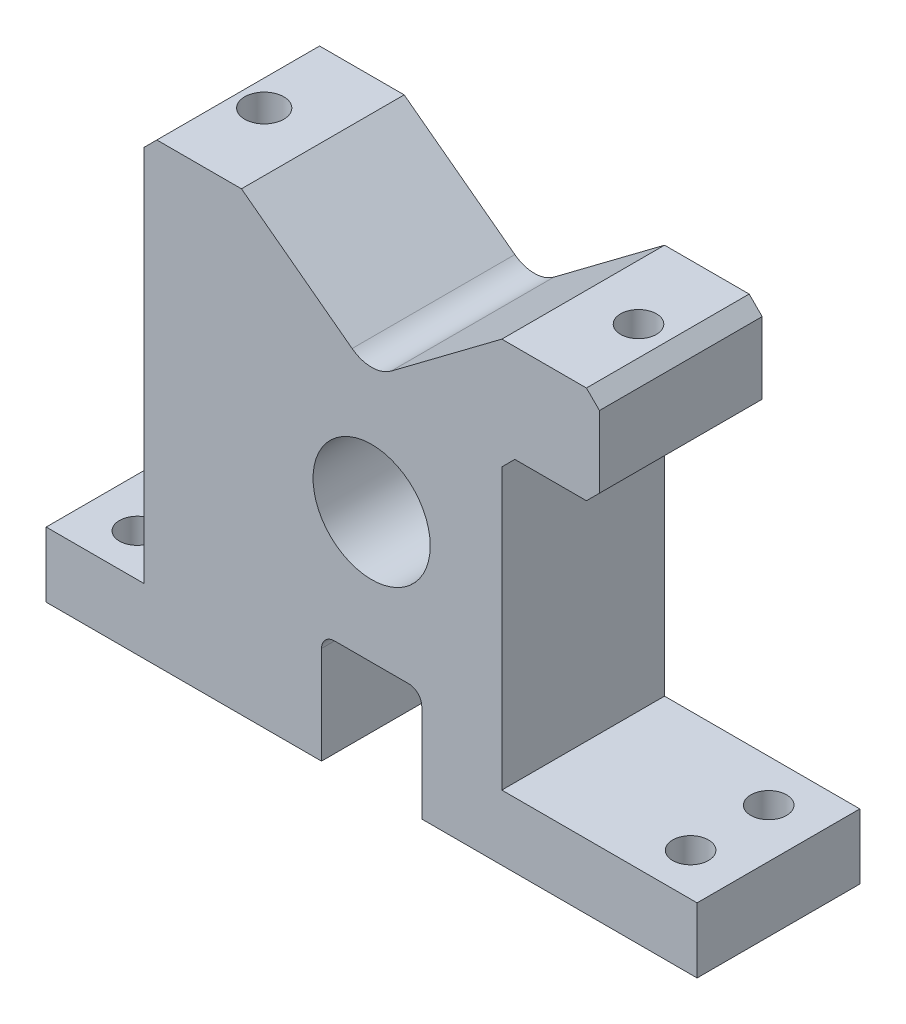
ISO-10303-21;
HEADER;
FILE_DESCRIPTION(('STEP AP214'),'2;1');
FILE_NAME('part.step','',(''),(''),'','','');
FILE_SCHEMA(('AUTOMOTIVE_DESIGN { 1 0 10303 214 1 1 1 1 }'));
ENDSEC;
DATA;
#1=APPLICATION_CONTEXT('core data for automotive mechanical design processes');
#2=APPLICATION_PROTOCOL_DEFINITION('international standard','automotive_design',2000,#1);
#3=PRODUCT_CONTEXT('',#1,'mechanical');
#4=PRODUCT('Part','Part','',(#3));
#5=PRODUCT_RELATED_PRODUCT_CATEGORY('part','',(#4));
#6=PRODUCT_DEFINITION_FORMATION('','',#4);
#7=PRODUCT_DEFINITION_CONTEXT('part definition',#1,'design');
#8=PRODUCT_DEFINITION('design','',#6,#7);
#9=PRODUCT_DEFINITION_SHAPE('','',#8);
#10=(LENGTH_UNIT() NAMED_UNIT(*) SI_UNIT(.MILLI.,.METRE.));
#11=(NAMED_UNIT(*) PLANE_ANGLE_UNIT() SI_UNIT($,.RADIAN.));
#12=(NAMED_UNIT(*) SI_UNIT($,.STERADIAN.) SOLID_ANGLE_UNIT());
#13=UNCERTAINTY_MEASURE_WITH_UNIT(LENGTH_MEASURE(1.E-05),#10,'distance_accuracy_value','');
#14=(GEOMETRIC_REPRESENTATION_CONTEXT(3) GLOBAL_UNCERTAINTY_ASSIGNED_CONTEXT((#13)) GLOBAL_UNIT_ASSIGNED_CONTEXT((#10,
#11,#12)) REPRESENTATION_CONTEXT('',''));
#15=CARTESIAN_POINT('',(0.,0.,0.));
#16=DIRECTION('',(0.,0.,1.));
#17=DIRECTION('',(1.,0.,0.));
#18=AXIS2_PLACEMENT_3D('',#15,#16,#17);
#19=CARTESIAN_POINT('',(0.,37.,25.));
#20=DIRECTION('',(0.,0.,-1.));
#21=DIRECTION('',(-1.,0.,0.));
#22=AXIS2_PLACEMENT_3D('',#19,#20,#21);
#23=CYLINDRICAL_SURFACE('',#22,11.2);
#24=CARTESIAN_POINT('',(0.,37.,0.));
#25=DIRECTION('',(0.,0.,-1.));
#26=DIRECTION('',(-1.,0.,0.));
#27=AXIS2_PLACEMENT_3D('',#24,#25,#26);
#28=CIRCLE('',#27,11.2);
#29=CARTESIAN_POINT('',(-11.2,37.,0.));
#30=VERTEX_POINT('',#29);
#31=EDGE_CURVE('E251',#30,#30,#28,.T.);
#32=ORIENTED_EDGE('',*,*,#31,.T.);
#33=EDGE_LOOP('',(#32));
#34=FACE_BOUND('',#33,.T.);
#35=CARTESIAN_POINT('',(0.,37.,7.));
#36=DIRECTION('',(0.,0.,1.));
#37=DIRECTION('',(1.,0.,0.));
#38=AXIS2_PLACEMENT_3D('',#35,#36,#37);
#39=CIRCLE('',#38,11.2);
#40=CARTESIAN_POINT('',(11.2,37.,7.));
#41=VERTEX_POINT('',#40);
#42=EDGE_CURVE('E11',#41,#41,#39,.F.);
#43=ORIENTED_EDGE('',*,*,#42,.F.);
#44=EDGE_LOOP('',(#43));
#45=FACE_BOUND('',#44,.T.);
#46=ADVANCED_FACE('F38',(#34,#45),#23,.F.);
#47=CARTESIAN_POINT('',(7.7,0.,25.));
#48=DIRECTION('',(0.,1.,0.));
#49=DIRECTION('',(-1.,0.,0.));
#50=AXIS2_PLACEMENT_3D('',#47,#48,#49);
#51=PLANE('',#50);
#52=CARTESIAN_POINT('',(42.5,0.,18.5));
#53=DIRECTION('',(0.,1.,0.));
#54=DIRECTION('',(-1.,0.,0.));
#55=AXIS2_PLACEMENT_3D('',#52,#53,#54);
#56=CIRCLE('',#55,2.74999999999999);
#57=CARTESIAN_POINT('',(39.75,0.,18.5));
#58=VERTEX_POINT('',#57);
#59=EDGE_CURVE('E226',#58,#58,#56,.T.);
#60=ORIENTED_EDGE('',*,*,#59,.T.);
#61=EDGE_LOOP('',(#60));
#62=FACE_BOUND('',#61,.T.);
#63=CARTESIAN_POINT('',(42.5,0.,6.5));
#64=DIRECTION('',(0.,1.,0.));
#65=DIRECTION('',(-1.,0.,0.));
#66=AXIS2_PLACEMENT_3D('',#63,#64,#65);
#67=CIRCLE('',#66,2.74999999999999);
#68=CARTESIAN_POINT('',(39.75,0.,6.5));
#69=VERTEX_POINT('',#68);
#70=EDGE_CURVE('E232',#69,#69,#67,.T.);
#71=ORIENTED_EDGE('',*,*,#70,.T.);
#72=EDGE_LOOP('',(#71));
#73=FACE_BOUND('',#72,.T.);
#74=DIRECTION('',(1.,0.,0.));
#75=VECTOR('',#74,1.);
#76=CARTESIAN_POINT('',(7.7,0.,0.));
#77=LINE('',#76,#75);
#78=CARTESIAN_POINT('',(7.7,0.,0.));
#79=VERTEX_POINT('',#78);
#80=CARTESIAN_POINT('',(50.,0.,0.));
#81=VERTEX_POINT('',#80);
#82=EDGE_CURVE('E256',#79,#81,#77,.T.);
#83=ORIENTED_EDGE('',*,*,#82,.T.);
#84=DIRECTION('',(0.,0.,-1.));
#85=VECTOR('',#84,1.);
#86=CARTESIAN_POINT('',(50.,0.,25.));
#87=LINE('',#86,#85);
#88=CARTESIAN_POINT('',(50.,0.,25.));
#89=VERTEX_POINT('',#88);
#90=EDGE_CURVE('E390',#89,#81,#87,.T.);
#91=ORIENTED_EDGE('',*,*,#90,.F.);
#92=DIRECTION('',(1.,0.,0.));
#93=VECTOR('',#92,1.);
#94=CARTESIAN_POINT('',(7.7,0.,25.));
#95=LINE('',#94,#93);
#96=CARTESIAN_POINT('',(7.7,0.,25.));
#97=VERTEX_POINT('',#96);
#98=EDGE_CURVE('E257',#97,#89,#95,.T.);
#99=ORIENTED_EDGE('',*,*,#98,.F.);
#100=DIRECTION('',(0.,0.,-1.));
#101=VECTOR('',#100,1.);
#102=CARTESIAN_POINT('',(7.7,0.,25.));
#103=LINE('',#102,#101);
#104=EDGE_CURVE('E302',#97,#79,#103,.T.);
#105=ORIENTED_EDGE('',*,*,#104,.T.);
#106=EDGE_LOOP('',(#83,#91,#99,#105));
#107=FACE_BOUND('',#106,.T.);
#108=ADVANCED_FACE('F455',(#62,#73,#107),#51,.F.);
#109=CARTESIAN_POINT('',(50.,0.,25.));
#110=DIRECTION('',(-1.,0.,0.));
#111=DIRECTION('',(0.,0.,1.));
#112=AXIS2_PLACEMENT_3D('',#109,#110,#111);
#113=PLANE('',#112);
#114=DIRECTION('',(0.,1.,0.));
#115=VECTOR('',#114,1.);
#116=CARTESIAN_POINT('',(50.,0.,0.));
#117=LINE('',#116,#115);
#118=CARTESIAN_POINT('',(50.,10.,0.));
#119=VERTEX_POINT('',#118);
#120=EDGE_CURVE('E305',#81,#119,#117,.T.);
#121=ORIENTED_EDGE('',*,*,#120,.T.);
#122=DIRECTION('',(0.,0.,-1.));
#123=VECTOR('',#122,1.);
#124=CARTESIAN_POINT('',(50.,10.,25.));
#125=LINE('',#124,#123);
#126=CARTESIAN_POINT('',(50.,10.,25.));
#127=VERTEX_POINT('',#126);
#128=EDGE_CURVE('E387',#127,#119,#125,.T.);
#129=ORIENTED_EDGE('',*,*,#128,.F.);
#130=DIRECTION('',(0.,1.,0.));
#131=VECTOR('',#130,1.);
#132=CARTESIAN_POINT('',(50.,0.,25.));
#133=LINE('',#132,#131);
#134=EDGE_CURVE('E260',#89,#127,#133,.T.);
#135=ORIENTED_EDGE('',*,*,#134,.F.);
#136=ORIENTED_EDGE('',*,*,#90,.T.);
#137=EDGE_LOOP('',(#121,#129,#135,#136));
#138=FACE_BOUND('',#137,.T.);
#139=ADVANCED_FACE('F451',(#138),#113,.F.);
#140=CARTESIAN_POINT('',(20.,10.,25.));
#141=DIRECTION('',(0.,-1.,0.));
#142=DIRECTION('',(0.,0.,-1.));
#143=AXIS2_PLACEMENT_3D('',#140,#141,#142);
#144=PLANE('',#143);
#145=CARTESIAN_POINT('',(42.5,10.,18.5));
#146=DIRECTION('',(0.,1.,0.));
#147=DIRECTION('',(0.,0.,1.));
#148=AXIS2_PLACEMENT_3D('',#145,#146,#147);
#149=CIRCLE('',#148,2.74999999999999);
#150=CARTESIAN_POINT('',(42.5,10.,21.25));
#151=VERTEX_POINT('',#150);
#152=EDGE_CURVE('E223',#151,#151,#149,.T.);
#153=ORIENTED_EDGE('',*,*,#152,.F.);
#154=EDGE_LOOP('',(#153));
#155=FACE_BOUND('',#154,.T.);
#156=CARTESIAN_POINT('',(42.5,10.,6.5));
#157=DIRECTION('',(0.,1.,0.));
#158=DIRECTION('',(0.,0.,1.));
#159=AXIS2_PLACEMENT_3D('',#156,#157,#158);
#160=CIRCLE('',#159,2.74999999999999);
#161=CARTESIAN_POINT('',(42.5,10.,9.24999999999999));
#162=VERTEX_POINT('',#161);
#163=EDGE_CURVE('E229',#162,#162,#160,.T.);
#164=ORIENTED_EDGE('',*,*,#163,.F.);
#165=EDGE_LOOP('',(#164));
#166=FACE_BOUND('',#165,.T.);
#167=DIRECTION('',(-1.,0.,0.));
#168=VECTOR('',#167,1.);
#169=CARTESIAN_POINT('',(20.,10.,0.));
#170=LINE('',#169,#168);
#171=CARTESIAN_POINT('',(20.,10.,0.));
#172=VERTEX_POINT('',#171);
#173=EDGE_CURVE('E308',#119,#172,#170,.T.);
#174=ORIENTED_EDGE('',*,*,#173,.T.);
#175=DIRECTION('',(0.,0.,-1.));
#176=VECTOR('',#175,1.);
#177=CARTESIAN_POINT('',(20.,10.,25.));
#178=LINE('',#177,#176);
#179=CARTESIAN_POINT('',(20.,10.,25.));
#180=VERTEX_POINT('',#179);
#181=EDGE_CURVE('E384',#180,#172,#178,.T.);
#182=ORIENTED_EDGE('',*,*,#181,.F.);
#183=DIRECTION('',(-1.,0.,0.));
#184=VECTOR('',#183,1.);
#185=CARTESIAN_POINT('',(50.,10.,25.));
#186=LINE('',#185,#184);
#187=EDGE_CURVE('E263',#127,#180,#186,.T.);
#188=ORIENTED_EDGE('',*,*,#187,.F.);
#189=ORIENTED_EDGE('',*,*,#128,.T.);
#190=EDGE_LOOP('',(#174,#182,#188,#189));
#191=FACE_BOUND('',#190,.T.);
#192=ADVANCED_FACE('F447',(#155,#166,#191),#144,.F.);
#193=CARTESIAN_POINT('',(20.,55.,25.));
#194=DIRECTION('',(-1.,0.,0.));
#195=DIRECTION('',(0.,0.,1.));
#196=AXIS2_PLACEMENT_3D('',#193,#194,#195);
#197=PLANE('',#196);
#198=DIRECTION('',(0.,1.,0.));
#199=VECTOR('',#198,1.);
#200=CARTESIAN_POINT('',(20.,55.,0.));
#201=LINE('',#200,#199);
#202=CARTESIAN_POINT('',(20.,53.,0.));
#203=VERTEX_POINT('',#202);
#204=EDGE_CURVE('E310',#172,#203,#201,.T.);
#205=ORIENTED_EDGE('',*,*,#204,.T.);
#206=DIRECTION('',(0.,0.,1.));
#207=VECTOR('',#206,1.);
#208=CARTESIAN_POINT('',(20.,53.,25.));
#209=LINE('',#208,#207);
#210=CARTESIAN_POINT('',(20.,53.,25.));
#211=VERTEX_POINT('',#210);
#212=EDGE_CURVE('E398',#203,#211,#209,.T.);
#213=ORIENTED_EDGE('',*,*,#212,.T.);
#214=DIRECTION('',(0.,1.,0.));
#215=VECTOR('',#214,1.);
#216=CARTESIAN_POINT('',(20.,55.,25.));
#217=LINE('',#216,#215);
#218=EDGE_CURVE('E265',#180,#211,#217,.T.);
#219=ORIENTED_EDGE('',*,*,#218,.F.);
#220=ORIENTED_EDGE('',*,*,#181,.T.);
#221=EDGE_LOOP('',(#205,#213,#219,#220));
#222=FACE_BOUND('',#221,.T.);
#223=ADVANCED_FACE('F443',(#222),#197,.F.);
#224=CARTESIAN_POINT('',(35.,55.,25.));
#225=DIRECTION('',(0.,1.,0.));
#226=DIRECTION('',(0.,0.,1.));
#227=AXIS2_PLACEMENT_3D('',#224,#225,#226);
#228=PLANE('',#227);
#229=CARTESIAN_POINT('',(28.5,55.,12.5));
#230=DIRECTION('',(0.,1.,0.));
#231=DIRECTION('',(0.,0.,1.));
#232=AXIS2_PLACEMENT_3D('',#229,#230,#231);
#233=CIRCLE('',#232,2.74999999999999);
#234=CARTESIAN_POINT('',(28.5,55.,15.25));
#235=VERTEX_POINT('',#234);
#236=EDGE_CURVE('E216',#235,#235,#233,.T.);
#237=ORIENTED_EDGE('',*,*,#236,.T.);
#238=EDGE_LOOP('',(#237));
#239=FACE_BOUND('',#238,.T.);
#240=DIRECTION('',(1.,0.,0.));
#241=VECTOR('',#240,1.);
#242=CARTESIAN_POINT('',(35.,55.,25.));
#243=LINE('',#242,#241);
#244=CARTESIAN_POINT('',(22.,55.,25.));
#245=VERTEX_POINT('',#244);
#246=CARTESIAN_POINT('',(33.,55.,25.));
#247=VERTEX_POINT('',#246);
#248=EDGE_CURVE('E268',#245,#247,#243,.T.);
#249=ORIENTED_EDGE('',*,*,#248,.F.);
#250=DIRECTION('',(0.,0.,-1.));
#251=VECTOR('',#250,1.);
#252=CARTESIAN_POINT('',(22.,55.,0.));
#253=LINE('',#252,#251);
#254=CARTESIAN_POINT('',(22.,55.,0.));
#255=VERTEX_POINT('',#254);
#256=EDGE_CURVE('E395',#245,#255,#253,.T.);
#257=ORIENTED_EDGE('',*,*,#256,.T.);
#258=DIRECTION('',(1.,0.,0.));
#259=VECTOR('',#258,1.);
#260=CARTESIAN_POINT('',(35.,55.,0.));
#261=LINE('',#260,#259);
#262=CARTESIAN_POINT('',(33.,55.,0.));
#263=VERTEX_POINT('',#262);
#264=EDGE_CURVE('E313',#255,#263,#261,.T.);
#265=ORIENTED_EDGE('',*,*,#264,.T.);
#266=DIRECTION('',(0.,0.,1.));
#267=VECTOR('',#266,1.);
#268=CARTESIAN_POINT('',(33.,55.,25.));
#269=LINE('',#268,#267);
#270=EDGE_CURVE('E393',#263,#247,#269,.T.);
#271=ORIENTED_EDGE('',*,*,#270,.T.);
#272=EDGE_LOOP('',(#249,#257,#265,#271));
#273=FACE_BOUND('',#272,.T.);
#274=ADVANCED_FACE('F434',(#239,#273),#228,.F.);
#275=CARTESIAN_POINT('',(35.,70.,25.));
#276=DIRECTION('',(-1.,0.,0.));
#277=DIRECTION('',(0.,0.,1.));
#278=AXIS2_PLACEMENT_3D('',#275,#276,#277);
#279=PLANE('',#278);
#280=DIRECTION('',(0.,1.,0.));
#281=VECTOR('',#280,1.);
#282=CARTESIAN_POINT('',(35.,70.,25.));
#283=LINE('',#282,#281);
#284=CARTESIAN_POINT('',(35.,57.,25.));
#285=VERTEX_POINT('',#284);
#286=CARTESIAN_POINT('',(35.,68.,25.));
#287=VERTEX_POINT('',#286);
#288=EDGE_CURVE('E271',#285,#287,#283,.T.);
#289=ORIENTED_EDGE('',*,*,#288,.F.);
#290=DIRECTION('',(0.,0.,-1.));
#291=VECTOR('',#290,1.);
#292=CARTESIAN_POINT('',(35.,57.,25.));
#293=LINE('',#292,#291);
#294=CARTESIAN_POINT('',(35.,57.,0.));
#295=VERTEX_POINT('',#294);
#296=EDGE_CURVE('E402',#285,#295,#293,.T.);
#297=ORIENTED_EDGE('',*,*,#296,.T.);
#298=DIRECTION('',(0.,1.,0.));
#299=VECTOR('',#298,1.);
#300=CARTESIAN_POINT('',(35.,70.,0.));
#301=LINE('',#300,#299);
#302=CARTESIAN_POINT('',(35.,68.,0.));
#303=VERTEX_POINT('',#302);
#304=EDGE_CURVE('E316',#295,#303,#301,.T.);
#305=ORIENTED_EDGE('',*,*,#304,.T.);
#306=DIRECTION('',(0.,0.,1.));
#307=VECTOR('',#306,1.);
#308=CARTESIAN_POINT('',(35.,68.,25.));
#309=LINE('',#308,#307);
#310=EDGE_CURVE('E400',#303,#287,#309,.T.);
#311=ORIENTED_EDGE('',*,*,#310,.T.);
#312=EDGE_LOOP('',(#289,#297,#305,#311));
#313=FACE_BOUND('',#312,.T.);
#314=ADVANCED_FACE('F572',(#313),#279,.F.);
#315=CARTESIAN_POINT('',(35.,70.,25.));
#316=DIRECTION('',(0.,-1.,0.));
#317=DIRECTION('',(1.,0.,0.));
#318=AXIS2_PLACEMENT_3D('',#315,#316,#317);
#319=PLANE('',#318);
#320=CARTESIAN_POINT('',(28.5,70.,12.5));
#321=DIRECTION('',(0.,1.,0.));
#322=DIRECTION('',(0.,0.,1.));
#323=AXIS2_PLACEMENT_3D('',#320,#321,#322);
#324=CIRCLE('',#323,2.74999999999999);
#325=CARTESIAN_POINT('',(28.5,70.,15.25));
#326=VERTEX_POINT('',#325);
#327=EDGE_CURVE('E212',#326,#326,#324,.T.);
#328=ORIENTED_EDGE('',*,*,#327,.F.);
#329=EDGE_LOOP('',(#328));
#330=FACE_BOUND('',#329,.T.);
#331=DIRECTION('',(-1.,0.,0.));
#332=VECTOR('',#331,1.);
#333=CARTESIAN_POINT('',(35.,70.,25.));
#334=LINE('',#333,#332);
#335=CARTESIAN_POINT('',(33.,70.,25.));
#336=VERTEX_POINT('',#335);
#337=CARTESIAN_POINT('',(20.,70.,25.));
#338=VERTEX_POINT('',#337);
#339=EDGE_CURVE('E274',#336,#338,#334,.T.);
#340=ORIENTED_EDGE('',*,*,#339,.F.);
#341=DIRECTION('',(0.,0.,-1.));
#342=VECTOR('',#341,1.);
#343=CARTESIAN_POINT('',(33.,70.,25.));
#344=LINE('',#343,#342);
#345=CARTESIAN_POINT('',(33.,70.,0.));
#346=VERTEX_POINT('',#345);
#347=EDGE_CURVE('E416',#336,#346,#344,.T.);
#348=ORIENTED_EDGE('',*,*,#347,.T.);
#349=DIRECTION('',(-1.,0.,0.));
#350=VECTOR('',#349,1.);
#351=CARTESIAN_POINT('',(35.,70.,0.));
#352=LINE('',#351,#350);
#353=CARTESIAN_POINT('',(20.,70.,0.));
#354=VERTEX_POINT('',#353);
#355=EDGE_CURVE('E319',#346,#354,#352,.T.);
#356=ORIENTED_EDGE('',*,*,#355,.T.);
#357=DIRECTION('',(0.,0.,-1.));
#358=VECTOR('',#357,1.);
#359=CARTESIAN_POINT('',(20.,70.,25.));
#360=LINE('',#359,#358);
#361=EDGE_CURVE('E381',#338,#354,#360,.T.);
#362=ORIENTED_EDGE('',*,*,#361,.F.);
#363=EDGE_LOOP('',(#340,#348,#356,#362));
#364=FACE_BOUND('',#363,.T.);
#365=ADVANCED_FACE('F568',(#330,#364),#319,.F.);
#366=CARTESIAN_POINT('',(3.00000000000002,57.25,25.));
#367=DIRECTION('',(0.6,-0.8,0.));
#368=DIRECTION('',(0.8,0.6,0.));
#369=AXIS2_PLACEMENT_3D('',#366,#367,#368);
#370=PLANE('',#369);
#371=DIRECTION('',(-0.8,-0.6,0.));
#372=VECTOR('',#371,1.);
#373=CARTESIAN_POINT('',(3.00000000000002,57.25,0.));
#374=LINE('',#373,#372);
#375=CARTESIAN_POINT('',(3.00000000000002,57.25,0.));
#376=VERTEX_POINT('',#375);
#377=EDGE_CURVE('E321',#354,#376,#374,.T.);
#378=ORIENTED_EDGE('',*,*,#377,.T.);
#379=DIRECTION('',(0.,0.,-1.));
#380=VECTOR('',#379,1.);
#381=CARTESIAN_POINT('',(3.00000000000002,57.25,25.));
#382=LINE('',#381,#380);
#383=CARTESIAN_POINT('',(3.00000000000002,57.25,25.));
#384=VERTEX_POINT('',#383);
#385=EDGE_CURVE('E378',#384,#376,#382,.T.);
#386=ORIENTED_EDGE('',*,*,#385,.F.);
#387=DIRECTION('',(-0.8,-0.6,0.));
#388=VECTOR('',#387,1.);
#389=CARTESIAN_POINT('',(3.00000000000002,57.25,25.));
#390=LINE('',#389,#388);
#391=EDGE_CURVE('E276',#338,#384,#390,.T.);
#392=ORIENTED_EDGE('',*,*,#391,.F.);
#393=ORIENTED_EDGE('',*,*,#361,.T.);
#394=EDGE_LOOP('',(#378,#386,#392,#393));
#395=FACE_BOUND('',#394,.T.);
#396=ADVANCED_FACE('F564',(#395),#370,.F.);
#397=CARTESIAN_POINT('',(0.,61.25,25.));
#398=DIRECTION('',(0.,0.,-1.));
#399=DIRECTION('',(-1.,0.,0.));
#400=AXIS2_PLACEMENT_3D('',#397,#398,#399);
#401=CYLINDRICAL_SURFACE('',#400,5.);
#402=CARTESIAN_POINT('',(0.,61.25,0.));
#403=DIRECTION('',(0.,0.,-1.));
#404=DIRECTION('',(-1.,0.,0.));
#405=AXIS2_PLACEMENT_3D('',#402,#403,#404);
#406=CIRCLE('',#405,5.);
#407=CARTESIAN_POINT('',(-3.00000000000002,57.25,0.));
#408=VERTEX_POINT('',#407);
#409=EDGE_CURVE('E323',#376,#408,#406,.T.);
#410=ORIENTED_EDGE('',*,*,#409,.T.);
#411=DIRECTION('',(0.,0.,-1.));
#412=VECTOR('',#411,1.);
#413=CARTESIAN_POINT('',(-3.00000000000002,57.25,25.));
#414=LINE('',#413,#412);
#415=CARTESIAN_POINT('',(-3.00000000000002,57.25,25.));
#416=VERTEX_POINT('',#415);
#417=EDGE_CURVE('E375',#416,#408,#414,.T.);
#418=ORIENTED_EDGE('',*,*,#417,.F.);
#419=CARTESIAN_POINT('',(0.,61.25,25.));
#420=DIRECTION('',(0.,0.,-1.));
#421=DIRECTION('',(-1.,0.,0.));
#422=AXIS2_PLACEMENT_3D('',#419,#420,#421);
#423=CIRCLE('',#422,5.);
#424=EDGE_CURVE('E278',#384,#416,#423,.T.);
#425=ORIENTED_EDGE('',*,*,#424,.F.);
#426=ORIENTED_EDGE('',*,*,#385,.T.);
#427=EDGE_LOOP('',(#410,#418,#425,#426));
#428=FACE_BOUND('',#427,.T.);
#429=ADVANCED_FACE('F560',(#428),#401,.F.);
#430=CARTESIAN_POINT('',(-3.00000000000002,57.25,25.));
#431=DIRECTION('',(-0.6,-0.8,0.));
#432=DIRECTION('',(0.8,-0.6,0.));
#433=AXIS2_PLACEMENT_3D('',#430,#431,#432);
#434=PLANE('',#433);
#435=DIRECTION('',(-0.8,0.6,0.));
#436=VECTOR('',#435,1.);
#437=CARTESIAN_POINT('',(-3.00000000000002,57.25,0.));
#438=LINE('',#437,#436);
#439=CARTESIAN_POINT('',(-20.,70.,0.));
#440=VERTEX_POINT('',#439);
#441=EDGE_CURVE('E325',#408,#440,#438,.T.);
#442=ORIENTED_EDGE('',*,*,#441,.T.);
#443=DIRECTION('',(0.,0.,-1.));
#444=VECTOR('',#443,1.);
#445=CARTESIAN_POINT('',(-20.,70.,25.));
#446=LINE('',#445,#444);
#447=CARTESIAN_POINT('',(-20.,70.,25.));
#448=VERTEX_POINT('',#447);
#449=EDGE_CURVE('E372',#448,#440,#446,.T.);
#450=ORIENTED_EDGE('',*,*,#449,.F.);
#451=DIRECTION('',(-0.8,0.6,0.));
#452=VECTOR('',#451,1.);
#453=CARTESIAN_POINT('',(-3.00000000000002,57.25,25.));
#454=LINE('',#453,#452);
#455=EDGE_CURVE('E280',#416,#448,#454,.T.);
#456=ORIENTED_EDGE('',*,*,#455,.F.);
#457=ORIENTED_EDGE('',*,*,#417,.T.);
#458=EDGE_LOOP('',(#442,#450,#456,#457));
#459=FACE_BOUND('',#458,.T.);
#460=ADVANCED_FACE('F556',(#459),#434,.F.);
#461=CARTESIAN_POINT('',(-35.,70.,25.));
#462=DIRECTION('',(0.,-1.,0.));
#463=DIRECTION('',(1.,0.,0.));
#464=AXIS2_PLACEMENT_3D('',#461,#462,#463);
#465=PLANE('',#464);
#466=CARTESIAN_POINT('',(-29.,70.,12.5));
#467=DIRECTION('',(0.,1.,0.));
#468=DIRECTION('',(0.,0.,1.));
#469=AXIS2_PLACEMENT_3D('',#466,#467,#468);
#470=CIRCLE('',#469,3.);
#471=CARTESIAN_POINT('',(-29.,70.,15.5));
#472=VERTEX_POINT('',#471);
#473=EDGE_CURVE('E213',#472,#472,#470,.T.);
#474=ORIENTED_EDGE('',*,*,#473,.F.);
#475=EDGE_LOOP('',(#474));
#476=FACE_BOUND('',#475,.T.);
#477=DIRECTION('',(-1.,0.,0.));
#478=VECTOR('',#477,1.);
#479=CARTESIAN_POINT('',(-35.,70.,0.));
#480=LINE('',#479,#478);
#481=CARTESIAN_POINT('',(-33.,70.,0.));
#482=VERTEX_POINT('',#481);
#483=EDGE_CURVE('E327',#440,#482,#480,.T.);
#484=ORIENTED_EDGE('',*,*,#483,.T.);
#485=DIRECTION('',(0.,0.,1.));
#486=VECTOR('',#485,1.);
#487=CARTESIAN_POINT('',(-33.,70.,25.));
#488=LINE('',#487,#486);
#489=CARTESIAN_POINT('',(-33.,70.,25.));
#490=VERTEX_POINT('',#489);
#491=EDGE_CURVE('E61',#482,#490,#488,.T.);
#492=ORIENTED_EDGE('',*,*,#491,.T.);
#493=DIRECTION('',(-1.,0.,0.));
#494=VECTOR('',#493,1.);
#495=CARTESIAN_POINT('',(-35.,70.,25.));
#496=LINE('',#495,#494);
#497=EDGE_CURVE('E282',#448,#490,#496,.T.);
#498=ORIENTED_EDGE('',*,*,#497,.F.);
#499=ORIENTED_EDGE('',*,*,#449,.T.);
#500=EDGE_LOOP('',(#484,#492,#498,#499));
#501=FACE_BOUND('',#500,.T.);
#502=ADVANCED_FACE('F504',(#476,#501),#465,.F.);
#503=CARTESIAN_POINT('',(-35.,10.,25.));
#504=DIRECTION('',(1.,0.,0.));
#505=DIRECTION('',(0.,0.,-1.));
#506=AXIS2_PLACEMENT_3D('',#503,#504,#505);
#507=PLANE('',#506);
#508=DIRECTION('',(0.,-1.,0.));
#509=VECTOR('',#508,1.);
#510=CARTESIAN_POINT('',(-35.,10.,25.));
#511=LINE('',#510,#509);
#512=CARTESIAN_POINT('',(-35.,68.,25.));
#513=VERTEX_POINT('',#512);
#514=CARTESIAN_POINT('',(-35.,10.,25.));
#515=VERTEX_POINT('',#514);
#516=EDGE_CURVE('E284',#513,#515,#511,.T.);
#517=ORIENTED_EDGE('',*,*,#516,.F.);
#518=DIRECTION('',(0.,0.,-1.));
#519=VECTOR('',#518,1.);
#520=CARTESIAN_POINT('',(-35.,68.,25.));
#521=LINE('',#520,#519);
#522=CARTESIAN_POINT('',(-35.,68.,0.));
#523=VERTEX_POINT('',#522);
#524=EDGE_CURVE('E419',#513,#523,#521,.T.);
#525=ORIENTED_EDGE('',*,*,#524,.T.);
#526=DIRECTION('',(0.,-1.,0.));
#527=VECTOR('',#526,1.);
#528=CARTESIAN_POINT('',(-35.,10.,0.));
#529=LINE('',#528,#527);
#530=CARTESIAN_POINT('',(-35.,10.,0.));
#531=VERTEX_POINT('',#530);
#532=EDGE_CURVE('E329',#523,#531,#529,.T.);
#533=ORIENTED_EDGE('',*,*,#532,.T.);
#534=DIRECTION('',(0.,0.,-1.));
#535=VECTOR('',#534,1.);
#536=CARTESIAN_POINT('',(-35.,10.,25.));
#537=LINE('',#536,#535);
#538=EDGE_CURVE('E369',#515,#531,#537,.T.);
#539=ORIENTED_EDGE('',*,*,#538,.F.);
#540=EDGE_LOOP('',(#517,#525,#533,#539));
#541=FACE_BOUND('',#540,.T.);
#542=ADVANCED_FACE('F499',(#541),#507,.F.);
#543=CARTESIAN_POINT('',(-50.,10.,25.));
#544=DIRECTION('',(0.,-1.,0.));
#545=DIRECTION('',(1.,0.,0.));
#546=AXIS2_PLACEMENT_3D('',#543,#544,#545);
#547=PLANE('',#546);
#548=CARTESIAN_POINT('',(-42.5,10.,18.5));
#549=DIRECTION('',(0.,1.,0.));
#550=DIRECTION('',(0.,0.,1.));
#551=AXIS2_PLACEMENT_3D('',#548,#549,#550);
#552=CIRCLE('',#551,2.74999999999999);
#553=CARTESIAN_POINT('',(-42.5,10.,21.25));
#554=VERTEX_POINT('',#553);
#555=EDGE_CURVE('E235',#554,#554,#552,.T.);
#556=ORIENTED_EDGE('',*,*,#555,.F.);
#557=EDGE_LOOP('',(#556));
#558=FACE_BOUND('',#557,.T.);
#559=CARTESIAN_POINT('',(-42.5,10.,6.5));
#560=DIRECTION('',(0.,1.,0.));
#561=DIRECTION('',(0.,0.,1.));
#562=AXIS2_PLACEMENT_3D('',#559,#560,#561);
#563=CIRCLE('',#562,2.74999999999999);
#564=CARTESIAN_POINT('',(-42.5,10.,9.24999999999999));
#565=VERTEX_POINT('',#564);
#566=EDGE_CURVE('E241',#565,#565,#563,.T.);
#567=ORIENTED_EDGE('',*,*,#566,.F.);
#568=EDGE_LOOP('',(#567));
#569=FACE_BOUND('',#568,.T.);
#570=DIRECTION('',(-1.,0.,0.));
#571=VECTOR('',#570,1.);
#572=CARTESIAN_POINT('',(-50.,10.,0.));
#573=LINE('',#572,#571);
#574=CARTESIAN_POINT('',(-50.,10.,0.));
#575=VERTEX_POINT('',#574);
#576=EDGE_CURVE('E331',#531,#575,#573,.T.);
#577=ORIENTED_EDGE('',*,*,#576,.T.);
#578=DIRECTION('',(0.,0.,-1.));
#579=VECTOR('',#578,1.);
#580=CARTESIAN_POINT('',(-50.,10.,25.));
#581=LINE('',#580,#579);
#582=CARTESIAN_POINT('',(-50.,10.,25.));
#583=VERTEX_POINT('',#582);
#584=EDGE_CURVE('E366',#583,#575,#581,.T.);
#585=ORIENTED_EDGE('',*,*,#584,.F.);
#586=DIRECTION('',(-1.,0.,0.));
#587=VECTOR('',#586,1.);
#588=CARTESIAN_POINT('',(-50.,10.,25.));
#589=LINE('',#588,#587);
#590=EDGE_CURVE('E286',#515,#583,#589,.T.);
#591=ORIENTED_EDGE('',*,*,#590,.F.);
#592=ORIENTED_EDGE('',*,*,#538,.T.);
#593=EDGE_LOOP('',(#577,#585,#591,#592));
#594=FACE_BOUND('',#593,.T.);
#595=ADVANCED_FACE('F496',(#558,#569,#594),#547,.F.);
#596=CARTESIAN_POINT('',(-50.,0.,25.));
#597=DIRECTION('',(1.,0.,0.));
#598=DIRECTION('',(0.,0.,-1.));
#599=AXIS2_PLACEMENT_3D('',#596,#597,#598);
#600=PLANE('',#599);
#601=DIRECTION('',(0.,-1.,0.));
#602=VECTOR('',#601,1.);
#603=CARTESIAN_POINT('',(-50.,0.,0.));
#604=LINE('',#603,#602);
#605=CARTESIAN_POINT('',(-50.,0.,0.));
#606=VERTEX_POINT('',#605);
#607=EDGE_CURVE('E333',#575,#606,#604,.T.);
#608=ORIENTED_EDGE('',*,*,#607,.T.);
#609=DIRECTION('',(0.,0.,-1.));
#610=VECTOR('',#609,1.);
#611=CARTESIAN_POINT('',(-50.,0.,25.));
#612=LINE('',#611,#610);
#613=CARTESIAN_POINT('',(-50.,0.,25.));
#614=VERTEX_POINT('',#613);
#615=EDGE_CURVE('E363',#614,#606,#612,.T.);
#616=ORIENTED_EDGE('',*,*,#615,.F.);
#617=DIRECTION('',(0.,-1.,0.));
#618=VECTOR('',#617,1.);
#619=CARTESIAN_POINT('',(-50.,0.,25.));
#620=LINE('',#619,#618);
#621=EDGE_CURVE('E288',#583,#614,#620,.T.);
#622=ORIENTED_EDGE('',*,*,#621,.F.);
#623=ORIENTED_EDGE('',*,*,#584,.T.);
#624=EDGE_LOOP('',(#608,#616,#622,#623));
#625=FACE_BOUND('',#624,.T.);
#626=ADVANCED_FACE('F491',(#625),#600,.F.);
#627=CARTESIAN_POINT('',(-7.7,0.,25.));
#628=DIRECTION('',(0.,1.,0.));
#629=DIRECTION('',(-1.,0.,0.));
#630=AXIS2_PLACEMENT_3D('',#627,#628,#629);
#631=PLANE('',#630);
#632=CARTESIAN_POINT('',(-42.5,0.,18.5));
#633=DIRECTION('',(0.,1.,0.));
#634=DIRECTION('',(-1.,0.,0.));
#635=AXIS2_PLACEMENT_3D('',#632,#633,#634);
#636=CIRCLE('',#635,2.74999999999999);
#637=CARTESIAN_POINT('',(-45.25,0.,18.5));
#638=VERTEX_POINT('',#637);
#639=EDGE_CURVE('E238',#638,#638,#636,.T.);
#640=ORIENTED_EDGE('',*,*,#639,.T.);
#641=EDGE_LOOP('',(#640));
#642=FACE_BOUND('',#641,.T.);
#643=CARTESIAN_POINT('',(-42.5,0.,6.5));
#644=DIRECTION('',(0.,1.,0.));
#645=DIRECTION('',(-1.,0.,0.));
#646=AXIS2_PLACEMENT_3D('',#643,#644,#645);
#647=CIRCLE('',#646,2.74999999999999);
#648=CARTESIAN_POINT('',(-45.25,0.,6.5));
#649=VERTEX_POINT('',#648);
#650=EDGE_CURVE('E244',#649,#649,#647,.T.);
#651=ORIENTED_EDGE('',*,*,#650,.T.);
#652=EDGE_LOOP('',(#651));
#653=FACE_BOUND('',#652,.T.);
#654=DIRECTION('',(1.,0.,0.));
#655=VECTOR('',#654,1.);
#656=CARTESIAN_POINT('',(-7.7,0.,0.));
#657=LINE('',#656,#655);
#658=CARTESIAN_POINT('',(-7.7,0.,0.));
#659=VERTEX_POINT('',#658);
#660=EDGE_CURVE('E335',#606,#659,#657,.T.);
#661=ORIENTED_EDGE('',*,*,#660,.T.);
#662=DIRECTION('',(0.,0.,-1.));
#663=VECTOR('',#662,1.);
#664=CARTESIAN_POINT('',(-7.7,0.,25.));
#665=LINE('',#664,#663);
#666=CARTESIAN_POINT('',(-7.7,0.,25.));
#667=VERTEX_POINT('',#666);
#668=EDGE_CURVE('E360',#667,#659,#665,.T.);
#669=ORIENTED_EDGE('',*,*,#668,.F.);
#670=DIRECTION('',(1.,0.,0.));
#671=VECTOR('',#670,1.);
#672=CARTESIAN_POINT('',(-7.7,0.,25.));
#673=LINE('',#672,#671);
#674=EDGE_CURVE('E290',#614,#667,#673,.T.);
#675=ORIENTED_EDGE('',*,*,#674,.F.);
#676=ORIENTED_EDGE('',*,*,#615,.T.);
#677=EDGE_LOOP('',(#661,#669,#675,#676));
#678=FACE_BOUND('',#677,.T.);
#679=ADVANCED_FACE('F485',(#642,#653,#678),#631,.F.);
#680=CARTESIAN_POINT('',(-7.7,15.,25.));
#681=DIRECTION('',(-1.,0.,0.));
#682=DIRECTION('',(0.,-1.,0.));
#683=AXIS2_PLACEMENT_3D('',#680,#681,#682);
#684=PLANE('',#683);
#685=DIRECTION('',(0.,1.,0.));
#686=VECTOR('',#685,1.);
#687=CARTESIAN_POINT('',(-7.7,15.,0.));
#688=LINE('',#687,#686);
#689=CARTESIAN_POINT('',(-7.7,15.,0.));
#690=VERTEX_POINT('',#689);
#691=EDGE_CURVE('E337',#659,#690,#688,.T.);
#692=ORIENTED_EDGE('',*,*,#691,.T.);
#693=DIRECTION('',(0.,0.,-1.));
#694=VECTOR('',#693,1.);
#695=CARTESIAN_POINT('',(-7.7,15.,25.));
#696=LINE('',#695,#694);
#697=CARTESIAN_POINT('',(-7.7,15.,25.));
#698=VERTEX_POINT('',#697);
#699=EDGE_CURVE('E357',#698,#690,#696,.T.);
#700=ORIENTED_EDGE('',*,*,#699,.F.);
#701=DIRECTION('',(0.,1.,0.));
#702=VECTOR('',#701,1.);
#703=CARTESIAN_POINT('',(-7.7,15.,25.));
#704=LINE('',#703,#702);
#705=EDGE_CURVE('E292',#667,#698,#704,.T.);
#706=ORIENTED_EDGE('',*,*,#705,.F.);
#707=ORIENTED_EDGE('',*,*,#668,.T.);
#708=EDGE_LOOP('',(#692,#700,#706,#707));
#709=FACE_BOUND('',#708,.T.);
#710=ADVANCED_FACE('F481',(#709),#684,.F.);
#711=CARTESIAN_POINT('',(-5.7,15.,25.));
#712=DIRECTION('',(0.,0.,-1.));
#713=DIRECTION('',(-1.,0.,0.));
#714=AXIS2_PLACEMENT_3D('',#711,#712,#713);
#715=CYLINDRICAL_SURFACE('',#714,2.);
#716=CARTESIAN_POINT('',(-5.7,15.,0.));
#717=DIRECTION('',(0.,0.,-1.));
#718=DIRECTION('',(-1.,0.,0.));
#719=AXIS2_PLACEMENT_3D('',#716,#717,#718);
#720=CIRCLE('',#719,2.);
#721=CARTESIAN_POINT('',(-5.7,17.,0.));
#722=VERTEX_POINT('',#721);
#723=EDGE_CURVE('E339',#690,#722,#720,.T.);
#724=ORIENTED_EDGE('',*,*,#723,.T.);
#725=DIRECTION('',(0.,0.,-1.));
#726=VECTOR('',#725,1.);
#727=CARTESIAN_POINT('',(-5.7,17.,25.));
#728=LINE('',#727,#726);
#729=CARTESIAN_POINT('',(-5.7,17.,25.));
#730=VERTEX_POINT('',#729);
#731=EDGE_CURVE('E354',#730,#722,#728,.T.);
#732=ORIENTED_EDGE('',*,*,#731,.F.);
#733=CARTESIAN_POINT('',(-5.7,15.,25.));
#734=DIRECTION('',(0.,0.,-1.));
#735=DIRECTION('',(-1.,0.,0.));
#736=AXIS2_PLACEMENT_3D('',#733,#734,#735);
#737=CIRCLE('',#736,2.);
#738=EDGE_CURVE('E294',#698,#730,#737,.T.);
#739=ORIENTED_EDGE('',*,*,#738,.F.);
#740=ORIENTED_EDGE('',*,*,#699,.T.);
#741=EDGE_LOOP('',(#724,#732,#739,#740));
#742=FACE_BOUND('',#741,.T.);
#743=ADVANCED_FACE('F476',(#742),#715,.F.);
#744=CARTESIAN_POINT('',(-5.7,17.,25.));
#745=DIRECTION('',(0.,1.,0.));
#746=DIRECTION('',(0.,0.,1.));
#747=AXIS2_PLACEMENT_3D('',#744,#745,#746);
#748=PLANE('',#747);
#749=DIRECTION('',(1.,0.,0.));
#750=VECTOR('',#749,1.);
#751=CARTESIAN_POINT('',(-5.7,17.,0.));
#752=LINE('',#751,#750);
#753=CARTESIAN_POINT('',(5.7,17.,0.));
#754=VERTEX_POINT('',#753);
#755=EDGE_CURVE('E341',#722,#754,#752,.T.);
#756=ORIENTED_EDGE('',*,*,#755,.T.);
#757=DIRECTION('',(0.,0.,-1.));
#758=VECTOR('',#757,1.);
#759=CARTESIAN_POINT('',(5.7,17.,25.));
#760=LINE('',#759,#758);
#761=CARTESIAN_POINT('',(5.7,17.,25.));
#762=VERTEX_POINT('',#761);
#763=EDGE_CURVE('E351',#762,#754,#760,.T.);
#764=ORIENTED_EDGE('',*,*,#763,.F.);
#765=DIRECTION('',(1.,0.,0.));
#766=VECTOR('',#765,1.);
#767=CARTESIAN_POINT('',(-5.7,17.,25.));
#768=LINE('',#767,#766);
#769=EDGE_CURVE('E296',#730,#762,#768,.T.);
#770=ORIENTED_EDGE('',*,*,#769,.F.);
#771=ORIENTED_EDGE('',*,*,#731,.T.);
#772=EDGE_LOOP('',(#756,#764,#770,#771));
#773=FACE_BOUND('',#772,.T.);
#774=ADVANCED_FACE('F470',(#773),#748,.F.);
#775=CARTESIAN_POINT('',(5.7,15.,25.));
#776=DIRECTION('',(0.,0.,-1.));
#777=DIRECTION('',(-1.,0.,0.));
#778=AXIS2_PLACEMENT_3D('',#775,#776,#777);
#779=CYLINDRICAL_SURFACE('',#778,2.);
#780=CARTESIAN_POINT('',(5.7,15.,0.));
#781=DIRECTION('',(0.,0.,-1.));
#782=DIRECTION('',(1.,0.,0.));
#783=AXIS2_PLACEMENT_3D('',#780,#781,#782);
#784=CIRCLE('',#783,2.);
#785=CARTESIAN_POINT('',(7.7,15.,0.));
#786=VERTEX_POINT('',#785);
#787=EDGE_CURVE('E343',#754,#786,#784,.T.);
#788=ORIENTED_EDGE('',*,*,#787,.T.);
#789=DIRECTION('',(0.,0.,-1.));
#790=VECTOR('',#789,1.);
#791=CARTESIAN_POINT('',(7.7,15.,25.));
#792=LINE('',#791,#790);
#793=CARTESIAN_POINT('',(7.7,15.,25.));
#794=VERTEX_POINT('',#793);
#795=EDGE_CURVE('E348',#794,#786,#792,.T.);
#796=ORIENTED_EDGE('',*,*,#795,.F.);
#797=CARTESIAN_POINT('',(5.7,15.,25.));
#798=DIRECTION('',(0.,0.,-1.));
#799=DIRECTION('',(1.,0.,0.));
#800=AXIS2_PLACEMENT_3D('',#797,#798,#799);
#801=CIRCLE('',#800,2.);
#802=EDGE_CURVE('E298',#762,#794,#801,.T.);
#803=ORIENTED_EDGE('',*,*,#802,.F.);
#804=ORIENTED_EDGE('',*,*,#763,.T.);
#805=EDGE_LOOP('',(#788,#796,#803,#804));
#806=FACE_BOUND('',#805,.T.);
#807=ADVANCED_FACE('F466',(#806),#779,.F.);
#808=CARTESIAN_POINT('',(7.7,15.,25.));
#809=DIRECTION('',(1.,0.,0.));
#810=DIRECTION('',(0.,1.,0.));
#811=AXIS2_PLACEMENT_3D('',#808,#809,#810);
#812=PLANE('',#811);
#813=DIRECTION('',(0.,-1.,0.));
#814=VECTOR('',#813,1.);
#815=CARTESIAN_POINT('',(7.7,15.,0.));
#816=LINE('',#815,#814);
#817=EDGE_CURVE('E261',#786,#79,#816,.T.);
#818=ORIENTED_EDGE('',*,*,#817,.T.);
#819=ORIENTED_EDGE('',*,*,#104,.F.);
#820=DIRECTION('',(0.,-1.,0.));
#821=VECTOR('',#820,1.);
#822=CARTESIAN_POINT('',(7.7,15.,25.));
#823=LINE('',#822,#821);
#824=EDGE_CURVE('E300',#794,#97,#823,.T.);
#825=ORIENTED_EDGE('',*,*,#824,.F.);
#826=ORIENTED_EDGE('',*,*,#795,.T.);
#827=EDGE_LOOP('',(#818,#819,#825,#826));
#828=FACE_BOUND('',#827,.T.);
#829=ADVANCED_FACE('F461',(#828),#812,.F.);
#830=CARTESIAN_POINT('',(0.,61.25,25.));
#831=DIRECTION('',(0.,0.,-1.));
#832=DIRECTION('',(-1.,0.,0.));
#833=AXIS2_PLACEMENT_3D('',#830,#831,#832);
#834=PLANE('',#833);
#835=ORIENTED_EDGE('',*,*,#248,.T.);
#836=DIRECTION('',(-0.707106781186548,-0.707106781186548,0.));
#837=VECTOR('',#836,1.);
#838=CARTESIAN_POINT('',(35.,57.,25.));
#839=LINE('',#838,#837);
#840=EDGE_CURVE('E414',#247,#285,#839,.F.);
#841=ORIENTED_EDGE('',*,*,#840,.T.);
#842=ORIENTED_EDGE('',*,*,#288,.T.);
#843=DIRECTION('',(0.707106781186548,-0.707106781186548,0.));
#844=VECTOR('',#843,1.);
#845=CARTESIAN_POINT('',(33.,70.,25.));
#846=LINE('',#845,#844);
#847=EDGE_CURVE('E412',#287,#336,#846,.F.);
#848=ORIENTED_EDGE('',*,*,#847,.T.);
#849=ORIENTED_EDGE('',*,*,#339,.T.);
#850=ORIENTED_EDGE('',*,*,#391,.T.);
#851=ORIENTED_EDGE('',*,*,#424,.T.);
#852=ORIENTED_EDGE('',*,*,#455,.T.);
#853=ORIENTED_EDGE('',*,*,#497,.T.);
#854=DIRECTION('',(0.70710678118655,0.707106781186545,0.));
#855=VECTOR('',#854,1.);
#856=CARTESIAN_POINT('',(-35.,68.,25.));
#857=LINE('',#856,#855);
#858=EDGE_CURVE('E53',#490,#513,#857,.F.);
#859=ORIENTED_EDGE('',*,*,#858,.T.);
#860=ORIENTED_EDGE('',*,*,#516,.T.);
#861=ORIENTED_EDGE('',*,*,#590,.T.);
#862=ORIENTED_EDGE('',*,*,#621,.T.);
#863=ORIENTED_EDGE('',*,*,#674,.T.);
#864=ORIENTED_EDGE('',*,*,#705,.T.);
#865=ORIENTED_EDGE('',*,*,#738,.T.);
#866=ORIENTED_EDGE('',*,*,#769,.T.);
#867=ORIENTED_EDGE('',*,*,#802,.T.);
#868=ORIENTED_EDGE('',*,*,#824,.T.);
#869=ORIENTED_EDGE('',*,*,#98,.T.);
#870=ORIENTED_EDGE('',*,*,#134,.T.);
#871=ORIENTED_EDGE('',*,*,#187,.T.);
#872=ORIENTED_EDGE('',*,*,#218,.T.);
#873=DIRECTION('',(-0.707106781186552,-0.707106781186543,0.));
#874=VECTOR('',#873,1.);
#875=CARTESIAN_POINT('',(14.1249999999999,47.1249999999999,25.));
#876=LINE('',#875,#874);
#877=EDGE_CURVE('E46',#211,#245,#876,.F.);
#878=ORIENTED_EDGE('',*,*,#877,.T.);
#879=EDGE_LOOP('',(#835,#841,#842,#848,#849,#850,#851,#852,#853,#859,#860,#861,#862,#863,#864,
#865,#866,#867,#868,#869,#870,#871,#872,#878));
#880=FACE_BOUND('',#879,.T.);
#881=CARTESIAN_POINT('',(0.,37.,25.));
#882=DIRECTION('',(0.,0.,1.));
#883=DIRECTION('',(1.,0.,0.));
#884=AXIS2_PLACEMENT_3D('',#881,#882,#883);
#885=CIRCLE('',#884,9.);
#886=CARTESIAN_POINT('',(9.,37.,25.));
#887=VERTEX_POINT('',#886);
#888=EDGE_CURVE('E247',#887,#887,#885,.T.);
#889=ORIENTED_EDGE('',*,*,#888,.F.);
#890=EDGE_LOOP('',(#889));
#891=FACE_BOUND('',#890,.T.);
#892=ADVANCED_FACE('F426',(#880,#891),#834,.F.);
#893=CARTESIAN_POINT('',(0.,61.25,0.));
#894=DIRECTION('',(0.,0.,-1.));
#895=DIRECTION('',(-1.,0.,0.));
#896=AXIS2_PLACEMENT_3D('',#893,#894,#895);
#897=PLANE('',#896);
#898=ORIENTED_EDGE('',*,*,#31,.F.);
#899=EDGE_LOOP('',(#898));
#900=FACE_BOUND('',#899,.T.);
#901=ORIENTED_EDGE('',*,*,#304,.F.);
#902=DIRECTION('',(0.707106781186548,0.707106781186548,0.));
#903=VECTOR('',#902,1.);
#904=CARTESIAN_POINT('',(19.625,41.625,0.));
#905=LINE('',#904,#903);
#906=EDGE_CURVE('E409',#295,#263,#905,.F.);
#907=ORIENTED_EDGE('',*,*,#906,.T.);
#908=ORIENTED_EDGE('',*,*,#264,.F.);
#909=DIRECTION('',(0.707106781186552,0.707106781186543,0.));
#910=VECTOR('',#909,1.);
#911=CARTESIAN_POINT('',(22.,55.,0.));
#912=LINE('',#911,#910);
#913=EDGE_CURVE('E423',#255,#203,#912,.F.);
#914=ORIENTED_EDGE('',*,*,#913,.T.);
#915=ORIENTED_EDGE('',*,*,#204,.F.);
#916=ORIENTED_EDGE('',*,*,#173,.F.);
#917=ORIENTED_EDGE('',*,*,#120,.F.);
#918=ORIENTED_EDGE('',*,*,#82,.F.);
#919=ORIENTED_EDGE('',*,*,#817,.F.);
#920=ORIENTED_EDGE('',*,*,#787,.F.);
#921=ORIENTED_EDGE('',*,*,#755,.F.);
#922=ORIENTED_EDGE('',*,*,#723,.F.);
#923=ORIENTED_EDGE('',*,*,#691,.F.);
#924=ORIENTED_EDGE('',*,*,#660,.F.);
#925=ORIENTED_EDGE('',*,*,#607,.F.);
#926=ORIENTED_EDGE('',*,*,#576,.F.);
#927=ORIENTED_EDGE('',*,*,#532,.F.);
#928=DIRECTION('',(-0.70710678118655,-0.707106781186545,0.));
#929=VECTOR('',#928,1.);
#930=CARTESIAN_POINT('',(-20.8749999999999,82.125,0.));
#931=LINE('',#930,#929);
#932=EDGE_CURVE('E405',#523,#482,#931,.F.);
#933=ORIENTED_EDGE('',*,*,#932,.T.);
#934=ORIENTED_EDGE('',*,*,#483,.F.);
#935=ORIENTED_EDGE('',*,*,#441,.F.);
#936=ORIENTED_EDGE('',*,*,#409,.F.);
#937=ORIENTED_EDGE('',*,*,#377,.F.);
#938=ORIENTED_EDGE('',*,*,#355,.F.);
#939=DIRECTION('',(-0.707106781186548,0.707106781186548,0.));
#940=VECTOR('',#939,1.);
#941=CARTESIAN_POINT('',(20.875,82.125,0.));
#942=LINE('',#941,#940);
#943=EDGE_CURVE('E407',#346,#303,#942,.F.);
#944=ORIENTED_EDGE('',*,*,#943,.T.);
#945=EDGE_LOOP('',(#901,#907,#908,#914,#915,#916,#917,#918,#919,#920,#921,#922,#923,#924,#925,
#926,#927,#933,#934,#935,#936,#937,#938,#944));
#946=FACE_BOUND('',#945,.T.);
#947=ADVANCED_FACE('F441',(#900,#946),#897,.T.);
#948=CARTESIAN_POINT('',(22.,55.,25.));
#949=DIRECTION('',(0.707106781186542,-0.707106781186552,0.));
#950=DIRECTION('',(0.,0.,1.));
#951=AXIS2_PLACEMENT_3D('',#948,#949,#950);
#952=PLANE('',#951);
#953=ORIENTED_EDGE('',*,*,#877,.F.);
#954=ORIENTED_EDGE('',*,*,#212,.F.);
#955=ORIENTED_EDGE('',*,*,#913,.F.);
#956=ORIENTED_EDGE('',*,*,#256,.F.);
#957=EDGE_LOOP('',(#953,#954,#955,#956));
#958=FACE_BOUND('',#957,.T.);
#959=ADVANCED_FACE('F437',(#958),#952,.T.);
#960=CARTESIAN_POINT('',(35.,57.,25.));
#961=DIRECTION('',(-0.707106781186547,0.707106781186547,0.));
#962=DIRECTION('',(0.,0.,-1.));
#963=AXIS2_PLACEMENT_3D('',#960,#961,#962);
#964=PLANE('',#963);
#965=ORIENTED_EDGE('',*,*,#840,.F.);
#966=ORIENTED_EDGE('',*,*,#270,.F.);
#967=ORIENTED_EDGE('',*,*,#906,.F.);
#968=ORIENTED_EDGE('',*,*,#296,.F.);
#969=EDGE_LOOP('',(#965,#966,#967,#968));
#970=FACE_BOUND('',#969,.T.);
#971=ADVANCED_FACE('F516',(#970),#964,.F.);
#972=CARTESIAN_POINT('',(33.,70.,25.));
#973=DIRECTION('',(-0.707106781186547,-0.707106781186547,0.));
#974=DIRECTION('',(0.,0.,-1.));
#975=AXIS2_PLACEMENT_3D('',#972,#973,#974);
#976=PLANE('',#975);
#977=ORIENTED_EDGE('',*,*,#847,.F.);
#978=ORIENTED_EDGE('',*,*,#310,.F.);
#979=ORIENTED_EDGE('',*,*,#943,.F.);
#980=ORIENTED_EDGE('',*,*,#347,.F.);
#981=EDGE_LOOP('',(#977,#978,#979,#980));
#982=FACE_BOUND('',#981,.T.);
#983=ADVANCED_FACE('F508',(#982),#976,.F.);
#984=CARTESIAN_POINT('',(-35.,68.,25.));
#985=DIRECTION('',(0.707106781186545,-0.70710678118655,0.));
#986=DIRECTION('',(0.,0.,-1.));
#987=AXIS2_PLACEMENT_3D('',#984,#985,#986);
#988=PLANE('',#987);
#989=ORIENTED_EDGE('',*,*,#858,.F.);
#990=ORIENTED_EDGE('',*,*,#491,.F.);
#991=ORIENTED_EDGE('',*,*,#932,.F.);
#992=ORIENTED_EDGE('',*,*,#524,.F.);
#993=EDGE_LOOP('',(#989,#990,#991,#992));
#994=FACE_BOUND('',#993,.T.);
#995=ADVANCED_FACE('F40',(#994),#988,.F.);
#996=CARTESIAN_POINT('',(0.,37.,7.));
#997=DIRECTION('',(0.,0.,1.));
#998=DIRECTION('',(1.,0.,0.));
#999=AXIS2_PLACEMENT_3D('',#996,#997,#998);
#1000=PLANE('',#999);
#1001=CARTESIAN_POINT('',(0.,37.,7.));
#1002=DIRECTION('',(0.,0.,1.));
#1003=DIRECTION('',(1.,0.,0.));
#1004=AXIS2_PLACEMENT_3D('',#1001,#1002,#1003);
#1005=CIRCLE('',#1004,9.);
#1006=CARTESIAN_POINT('',(9.,37.,7.));
#1007=VERTEX_POINT('',#1006);
#1008=EDGE_CURVE('E248',#1007,#1007,#1005,.T.);
#1009=ORIENTED_EDGE('',*,*,#1008,.T.);
#1010=EDGE_LOOP('',(#1009));
#1011=FACE_BOUND('',#1010,.T.);
#1012=ORIENTED_EDGE('',*,*,#42,.T.);
#1013=EDGE_LOOP('',(#1012));
#1014=FACE_BOUND('',#1013,.T.);
#1015=ADVANCED_FACE('F507',(#1011,#1014),#1000,.F.);
#1016=CARTESIAN_POINT('',(0.,37.,7.));
#1017=DIRECTION('',(0.,0.,1.));
#1018=DIRECTION('',(1.,0.,0.));
#1019=AXIS2_PLACEMENT_3D('',#1016,#1017,#1018);
#1020=CYLINDRICAL_SURFACE('',#1019,9.);
#1021=ORIENTED_EDGE('',*,*,#1008,.F.);
#1022=EDGE_LOOP('',(#1021));
#1023=FACE_BOUND('',#1022,.T.);
#1024=ORIENTED_EDGE('',*,*,#888,.T.);
#1025=EDGE_LOOP('',(#1024));
#1026=FACE_BOUND('',#1025,.T.);
#1027=ADVANCED_FACE('F513',(#1023,#1026),#1020,.F.);
#1028=CARTESIAN_POINT('',(-42.5,10.,6.5));
#1029=DIRECTION('',(0.,1.,0.));
#1030=DIRECTION('',(0.,0.,1.));
#1031=AXIS2_PLACEMENT_3D('',#1028,#1029,#1030);
#1032=CYLINDRICAL_SURFACE('',#1031,2.74999999999999);
#1033=ORIENTED_EDGE('',*,*,#650,.F.);
#1034=EDGE_LOOP('',(#1033));
#1035=FACE_BOUND('',#1034,.T.);
#1036=ORIENTED_EDGE('',*,*,#566,.T.);
#1037=EDGE_LOOP('',(#1036));
#1038=FACE_BOUND('',#1037,.T.);
#1039=ADVANCED_FACE('F645',(#1035,#1038),#1032,.F.);
#1040=CARTESIAN_POINT('',(-42.5,10.,18.5));
#1041=DIRECTION('',(0.,1.,0.));
#1042=DIRECTION('',(0.,0.,1.));
#1043=AXIS2_PLACEMENT_3D('',#1040,#1041,#1042);
#1044=CYLINDRICAL_SURFACE('',#1043,2.74999999999999);
#1045=ORIENTED_EDGE('',*,*,#639,.F.);
#1046=EDGE_LOOP('',(#1045));
#1047=FACE_BOUND('',#1046,.T.);
#1048=ORIENTED_EDGE('',*,*,#555,.T.);
#1049=EDGE_LOOP('',(#1048));
#1050=FACE_BOUND('',#1049,.T.);
#1051=ADVANCED_FACE('F684',(#1047,#1050),#1044,.F.);
#1052=CARTESIAN_POINT('',(42.5,10.,6.5));
#1053=DIRECTION('',(0.,1.,0.));
#1054=DIRECTION('',(0.,0.,1.));
#1055=AXIS2_PLACEMENT_3D('',#1052,#1053,#1054);
#1056=CYLINDRICAL_SURFACE('',#1055,2.74999999999999);
#1057=ORIENTED_EDGE('',*,*,#70,.F.);
#1058=EDGE_LOOP('',(#1057));
#1059=FACE_BOUND('',#1058,.T.);
#1060=ORIENTED_EDGE('',*,*,#163,.T.);
#1061=EDGE_LOOP('',(#1060));
#1062=FACE_BOUND('',#1061,.T.);
#1063=ADVANCED_FACE('F694',(#1059,#1062),#1056,.F.);
#1064=CARTESIAN_POINT('',(42.5,10.,18.5));
#1065=DIRECTION('',(0.,1.,0.));
#1066=DIRECTION('',(0.,0.,1.));
#1067=AXIS2_PLACEMENT_3D('',#1064,#1065,#1066);
#1068=CYLINDRICAL_SURFACE('',#1067,2.74999999999999);
#1069=ORIENTED_EDGE('',*,*,#59,.F.);
#1070=EDGE_LOOP('',(#1069));
#1071=FACE_BOUND('',#1070,.T.);
#1072=ORIENTED_EDGE('',*,*,#152,.T.);
#1073=EDGE_LOOP('',(#1072));
#1074=FACE_BOUND('',#1073,.T.);
#1075=ADVANCED_FACE('F704',(#1071,#1074),#1068,.F.);
#1076=CARTESIAN_POINT('',(28.5,70.,12.5));
#1077=DIRECTION('',(0.,1.,0.));
#1078=DIRECTION('',(0.,0.,1.));
#1079=AXIS2_PLACEMENT_3D('',#1076,#1077,#1078);
#1080=CYLINDRICAL_SURFACE('',#1079,2.74999999999999);
#1081=ORIENTED_EDGE('',*,*,#236,.F.);
#1082=EDGE_LOOP('',(#1081));
#1083=FACE_BOUND('',#1082,.T.);
#1084=ORIENTED_EDGE('',*,*,#327,.T.);
#1085=EDGE_LOOP('',(#1084));
#1086=FACE_BOUND('',#1085,.T.);
#1087=ADVANCED_FACE('F206',(#1083,#1086),#1080,.F.);
#1088=CARTESIAN_POINT('',(-29.,30.,12.5));
#1089=DIRECTION('',(0.,1.,0.));
#1090=DIRECTION('',(0.,0.,1.));
#1091=AXIS2_PLACEMENT_3D('',#1088,#1089,#1090);
#1092=CONICAL_SURFACE('',#1091,2.99999999999999,1.02974425867665);
#1093=CARTESIAN_POINT('',(-29.,28.1974181429173,12.5));
#1094=VERTEX_POINT('',#1093);
#1095=VERTEX_LOOP('',#1094);
#1096=FACE_BOUND('',#1095,.T.);
#1097=CARTESIAN_POINT('',(-29.,30.,12.5));
#1098=DIRECTION('',(0.,1.,0.));
#1099=DIRECTION('',(0.,0.,1.));
#1100=AXIS2_PLACEMENT_3D('',#1097,#1098,#1099);
#1101=CIRCLE('',#1100,2.99999999999999);
#1102=CARTESIAN_POINT('',(-29.,30.,15.5));
#1103=VERTEX_POINT('',#1102);
#1104=EDGE_CURVE('E210',#1103,#1103,#1101,.T.);
#1105=ORIENTED_EDGE('',*,*,#1104,.T.);
#1106=EDGE_LOOP('',(#1105));
#1107=FACE_BOUND('',#1106,.T.);
#1108=ADVANCED_FACE('F202',(#1096,#1107),#1092,.F.);
#1109=CARTESIAN_POINT('',(-29.,70.,12.5));
#1110=DIRECTION('',(0.,1.,0.));
#1111=DIRECTION('',(0.,0.,1.));
#1112=AXIS2_PLACEMENT_3D('',#1109,#1110,#1111);
#1113=CYLINDRICAL_SURFACE('',#1112,3.);
#1114=ORIENTED_EDGE('',*,*,#1104,.F.);
#1115=EDGE_LOOP('',(#1114));
#1116=FACE_BOUND('',#1115,.T.);
#1117=ORIENTED_EDGE('',*,*,#473,.T.);
#1118=EDGE_LOOP('',(#1117));
#1119=FACE_BOUND('',#1118,.T.);
#1120=ADVANCED_FACE('F205',(#1116,#1119),#1113,.F.);
#1121=CLOSED_SHELL('',(#46,#108,#139,#192,#223,#274,#314,#365,#396,#429,#460,#502,#542,#595,
#626,#679,#710,#743,#774,#807,#829,#892,#947,#959,#971,#983,#995,#1015,#1027,#1039,#1051,#1063,
#1075,#1087,#1108,#1120));
#1122=MANIFOLD_SOLID_BREP('B2',#1121);
#1123=ADVANCED_BREP_SHAPE_REPRESENTATION('',(#18,#1122),#14);
#1124=SHAPE_DEFINITION_REPRESENTATION(#9,#1123);
ENDSEC;
END-ISO-10303-21;
